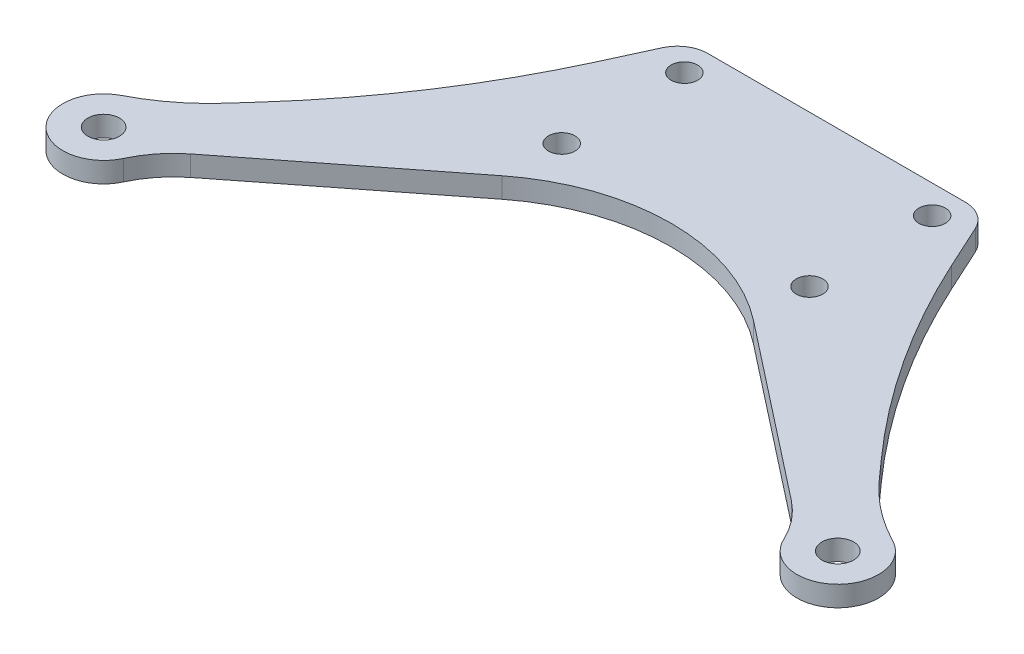
ISO-10303-21;
HEADER;
FILE_DESCRIPTION(('STEP AP214'),'2;1');
FILE_NAME('part.step','',(''),(''),'','','');
FILE_SCHEMA(('AUTOMOTIVE_DESIGN { 1 0 10303 214 1 1 1 1 }'));
ENDSEC;
DATA;
#1=APPLICATION_CONTEXT('core data for automotive mechanical design processes');
#2=APPLICATION_PROTOCOL_DEFINITION('international standard','automotive_design',2000,#1);
#3=PRODUCT_CONTEXT('',#1,'mechanical');
#4=PRODUCT('Part','Part','',(#3));
#5=PRODUCT_RELATED_PRODUCT_CATEGORY('part','',(#4));
#6=PRODUCT_DEFINITION_FORMATION('','',#4);
#7=PRODUCT_DEFINITION_CONTEXT('part definition',#1,'design');
#8=PRODUCT_DEFINITION('design','',#6,#7);
#9=PRODUCT_DEFINITION_SHAPE('','',#8);
#10=(LENGTH_UNIT() NAMED_UNIT(*) SI_UNIT(.MILLI.,.METRE.));
#11=(NAMED_UNIT(*) PLANE_ANGLE_UNIT() SI_UNIT($,.RADIAN.));
#12=(NAMED_UNIT(*) SI_UNIT($,.STERADIAN.) SOLID_ANGLE_UNIT());
#13=UNCERTAINTY_MEASURE_WITH_UNIT(LENGTH_MEASURE(1.E-05),#10,'distance_accuracy_value','');
#14=(GEOMETRIC_REPRESENTATION_CONTEXT(3) GLOBAL_UNCERTAINTY_ASSIGNED_CONTEXT((#13)) GLOBAL_UNIT_ASSIGNED_CONTEXT((#10,
#11,#12)) REPRESENTATION_CONTEXT('',''));
#15=CARTESIAN_POINT('',(0.,0.,0.));
#16=DIRECTION('',(0.,0.,1.));
#17=DIRECTION('',(1.,0.,0.));
#18=AXIS2_PLACEMENT_3D('',#15,#16,#17);
#19=CARTESIAN_POINT('',(-41.9300941590843,2.,-19.2548923078902));
#20=DIRECTION('',(0.90876140001654,0.,0.417316088642623));
#21=DIRECTION('',(0.417316088642623,0.,-0.90876140001654));
#22=AXIS2_PLACEMENT_3D('',#19,#20,#21);
#23=PLANE('',#22);
#24=DIRECTION('',(-0.417316088642623,0.,0.90876140001654));
#25=VECTOR('',#24,1.);
#26=CARTESIAN_POINT('',(-41.9300941590843,0.,-19.2548923078902));
#27=LINE('',#26,#25);
#28=CARTESIAN_POINT('',(-15.3497039199219,0.,-77.1372345039348));
#29=VERTEX_POINT('',#28);
#30=CARTESIAN_POINT('',(-17.3480088101479,0.,-72.7856592852359));
#31=VERTEX_POINT('',#30);
#32=EDGE_CURVE('E230',#29,#31,#27,.T.);
#33=ORIENTED_EDGE('',*,*,#32,.T.);
#34=DIRECTION('',(0.,-1.,0.));
#35=VECTOR('',#34,1.);
#36=CARTESIAN_POINT('',(-17.3480088101479,2.,-72.7856592852359));
#37=LINE('',#36,#35);
#38=CARTESIAN_POINT('',(-17.3480088101479,2.,-72.7856592852359));
#39=VERTEX_POINT('',#38);
#40=EDGE_CURVE('E11',#39,#31,#37,.T.);
#41=ORIENTED_EDGE('',*,*,#40,.F.);
#42=DIRECTION('',(-0.417316088642623,0.,0.90876140001654));
#43=VECTOR('',#42,1.);
#44=CARTESIAN_POINT('',(-41.9300941590843,2.,-19.2548923078902));
#45=LINE('',#44,#43);
#46=CARTESIAN_POINT('',(-15.3497039199219,2.,-77.1372345039348));
#47=VERTEX_POINT('',#46);
#48=EDGE_CURVE('E405',#47,#39,#45,.T.);
#49=ORIENTED_EDGE('',*,*,#48,.F.);
#50=DIRECTION('',(0.,-1.,0.));
#51=VECTOR('',#50,1.);
#52=CARTESIAN_POINT('',(-15.3497039199219,2.,-77.1372345039348));
#53=LINE('',#52,#51);
#54=EDGE_CURVE('E205',#47,#29,#53,.T.);
#55=ORIENTED_EDGE('',*,*,#54,.T.);
#56=EDGE_LOOP('',(#33,#41,#49,#55));
#57=FACE_BOUND('',#56,.T.);
#58=ADVANCED_FACE('F41',(#57),#23,.F.);
#59=CARTESIAN_POINT('',(-90.0489208114712,2.,-106.170946376645));
#60=DIRECTION('',(0.,-1.,0.));
#61=DIRECTION('',(0.,0.,-1.));
#62=AXIS2_PLACEMENT_3D('',#59,#60,#61);
#63=CYLINDRICAL_SURFACE('',#62,80.);
#64=CARTESIAN_POINT('',(-90.0489208114712,0.,-106.170946376645));
#65=DIRECTION('',(0.,1.,0.));
#66=DIRECTION('',(0.,0.,1.));
#67=AXIS2_PLACEMENT_3D('',#64,#65,#66);
#68=CIRCLE('',#67,80.);
#69=CARTESIAN_POINT('',(-30.4024630402206,0.,-52.8577202939704));
#70=VERTEX_POINT('',#69);
#71=EDGE_CURVE('E234',#31,#70,#68,.F.);
#72=ORIENTED_EDGE('',*,*,#71,.T.);
#73=DIRECTION('',(0.,-1.,0.));
#74=VECTOR('',#73,1.);
#75=CARTESIAN_POINT('',(-30.4024630402206,2.,-52.8577202939704));
#76=LINE('',#75,#74);
#77=CARTESIAN_POINT('',(-30.4024630402206,2.,-52.8577202939704));
#78=VERTEX_POINT('',#77);
#79=EDGE_CURVE('E51',#78,#70,#76,.T.);
#80=ORIENTED_EDGE('',*,*,#79,.F.);
#81=CARTESIAN_POINT('',(-90.0489208114712,2.,-106.170946376645));
#82=DIRECTION('',(0.,1.,0.));
#83=DIRECTION('',(0.,0.,1.));
#84=AXIS2_PLACEMENT_3D('',#81,#82,#83);
#85=CIRCLE('',#84,80.);
#86=EDGE_CURVE('E131',#39,#78,#85,.F.);
#87=ORIENTED_EDGE('',*,*,#86,.F.);
#88=ORIENTED_EDGE('',*,*,#40,.T.);
#89=EDGE_LOOP('',(#72,#80,#87,#88));
#90=FACE_BOUND('',#89,.T.);
#91=ADVANCED_FACE('F345',(#90),#63,.F.);
#92=CARTESIAN_POINT('',(-43.163670076453,2.,-38.5805727168108));
#93=DIRECTION('',(-0.745580722140635,0.,-0.666415326033435));
#94=DIRECTION('',(-0.666415326033435,0.,0.745580722140635));
#95=AXIS2_PLACEMENT_3D('',#92,#93,#94);
#96=PLANE('',#95);
#97=DIRECTION('',(0.666415326033435,0.,-0.745580722140635));
#98=VECTOR('',#97,1.);
#99=CARTESIAN_POINT('',(-43.163670076453,0.,-38.5805727168108));
#100=LINE('',#99,#98);
#101=CARTESIAN_POINT('',(-32.0372785443259,0.,-51.0287003472468));
#102=VERTEX_POINT('',#101);
#103=EDGE_CURVE('E238',#102,#70,#100,.T.);
#104=ORIENTED_EDGE('',*,*,#103,.F.);
#105=DIRECTION('',(0.,-1.,0.));
#106=VECTOR('',#105,1.);
#107=CARTESIAN_POINT('',(-32.0372785443259,2.,-51.0287003472468));
#108=LINE('',#107,#106);
#109=CARTESIAN_POINT('',(-32.0372785443259,2.,-51.0287003472468));
#110=VERTEX_POINT('',#109);
#111=EDGE_CURVE('E336',#110,#102,#108,.T.);
#112=ORIENTED_EDGE('',*,*,#111,.F.);
#113=DIRECTION('',(0.666415326033435,0.,-0.745580722140635));
#114=VECTOR('',#113,1.);
#115=CARTESIAN_POINT('',(-43.163670076453,2.,-38.5805727168108));
#116=LINE('',#115,#114);
#117=EDGE_CURVE('E344',#110,#78,#116,.T.);
#118=ORIENTED_EDGE('',*,*,#117,.T.);
#119=ORIENTED_EDGE('',*,*,#79,.T.);
#120=EDGE_LOOP('',(#104,#112,#118,#119));
#121=FACE_BOUND('',#120,.T.);
#122=ADVANCED_FACE('F342',(#121),#96,.T.);
#123=CARTESIAN_POINT('',(-46.9488929871386,2.,-64.3570068679155));
#124=DIRECTION('',(0.,-1.,0.));
#125=DIRECTION('',(0.,0.,-1.));
#126=AXIS2_PLACEMENT_3D('',#123,#124,#125);
#127=CYLINDRICAL_SURFACE('',#126,20.);
#128=CARTESIAN_POINT('',(-46.9488929871386,0.,-64.3570068679155));
#129=DIRECTION('',(0.,1.,0.));
#130=DIRECTION('',(0.,0.,1.));
#131=AXIS2_PLACEMENT_3D('',#128,#129,#130);
#132=CIRCLE('',#131,20.);
#133=CARTESIAN_POINT('',(-37.8248154978564,0.,-46.5595011446526));
#134=VERTEX_POINT('',#133);
#135=EDGE_CURVE('E242',#102,#134,#132,.F.);
#136=ORIENTED_EDGE('',*,*,#135,.T.);
#137=DIRECTION('',(0.,-1.,0.));
#138=VECTOR('',#137,1.);
#139=CARTESIAN_POINT('',(-37.8248154978564,2.,-46.5595011446526));
#140=LINE('',#139,#138);
#141=CARTESIAN_POINT('',(-37.8248154978564,2.,-46.5595011446526));
#142=VERTEX_POINT('',#141);
#143=EDGE_CURVE('E332',#142,#134,#140,.T.);
#144=ORIENTED_EDGE('',*,*,#143,.F.);
#145=CARTESIAN_POINT('',(-46.9488929871386,2.,-64.3570068679155));
#146=DIRECTION('',(0.,1.,0.));
#147=DIRECTION('',(0.,0.,1.));
#148=AXIS2_PLACEMENT_3D('',#145,#146,#147);
#149=CIRCLE('',#148,20.);
#150=EDGE_CURVE('E365',#110,#142,#149,.F.);
#151=ORIENTED_EDGE('',*,*,#150,.F.);
#152=ORIENTED_EDGE('',*,*,#111,.T.);
#153=EDGE_LOOP('',(#136,#144,#151,#152));
#154=FACE_BOUND('',#153,.T.);
#155=ADVANCED_FACE('F354',(#154),#127,.F.);
#156=CARTESIAN_POINT('',(-36.,2.,-43.));
#157=DIRECTION('',(0.,-1.,0.));
#158=DIRECTION('',(0.,0.,-1.));
#159=AXIS2_PLACEMENT_3D('',#156,#157,#158);
#160=CYLINDRICAL_SURFACE('',#159,4.);
#161=CARTESIAN_POINT('',(-36.,0.,-43.));
#162=DIRECTION('',(0.,1.,0.));
#163=DIRECTION('',(0.,0.,1.));
#164=AXIS2_PLACEMENT_3D('',#161,#162,#163);
#165=CIRCLE('',#164,4.);
#166=CARTESIAN_POINT('',(-32.370509150583,0.,-41.3186921239708));
#167=VERTEX_POINT('',#166);
#168=EDGE_CURVE('E245',#134,#167,#165,.T.);
#169=ORIENTED_EDGE('',*,*,#168,.T.);
#170=DIRECTION('',(0.,-1.,0.));
#171=VECTOR('',#170,1.);
#172=CARTESIAN_POINT('',(-32.370509150583,2.,-41.3186921239708));
#173=LINE('',#172,#171);
#174=CARTESIAN_POINT('',(-32.370509150583,2.,-41.3186921239708));
#175=VERTEX_POINT('',#174);
#176=EDGE_CURVE('E329',#175,#167,#173,.T.);
#177=ORIENTED_EDGE('',*,*,#176,.F.);
#178=CARTESIAN_POINT('',(-36.,2.,-43.));
#179=DIRECTION('',(0.,1.,0.));
#180=DIRECTION('',(0.,0.,1.));
#181=AXIS2_PLACEMENT_3D('',#178,#179,#180);
#182=CIRCLE('',#181,4.);
#183=EDGE_CURVE('E360',#142,#175,#182,.T.);
#184=ORIENTED_EDGE('',*,*,#183,.F.);
#185=ORIENTED_EDGE('',*,*,#143,.T.);
#186=EDGE_LOOP('',(#169,#177,#184,#185));
#187=FACE_BOUND('',#186,.T.);
#188=ADVANCED_FACE('F358',(#187),#160,.T.);
#189=CARTESIAN_POINT('',(-23.2967820270404,2.,-37.1154224338977));
#190=DIRECTION('',(0.,-1.,0.));
#191=DIRECTION('',(0.,0.,-1.));
#192=AXIS2_PLACEMENT_3D('',#189,#190,#191);
#193=CYLINDRICAL_SURFACE('',#192,10.);
#194=CARTESIAN_POINT('',(-23.2967820270404,0.,-37.1154224338977));
#195=DIRECTION('',(0.,1.,0.));
#196=DIRECTION('',(0.,0.,1.));
#197=AXIS2_PLACEMENT_3D('',#194,#195,#196);
#198=CIRCLE('',#197,10.);
#199=CARTESIAN_POINT('',(-29.4647501668188,0.,-44.9866465462374));
#200=VERTEX_POINT('',#199);
#201=EDGE_CURVE('E249',#200,#167,#198,.T.);
#202=ORIENTED_EDGE('',*,*,#201,.F.);
#203=DIRECTION('',(0.,-1.,0.));
#204=VECTOR('',#203,1.);
#205=CARTESIAN_POINT('',(-29.4647501668188,2.,-44.9866465462374));
#206=LINE('',#205,#204);
#207=CARTESIAN_POINT('',(-29.4647501668188,2.,-44.9866465462374));
#208=VERTEX_POINT('',#207);
#209=EDGE_CURVE('E326',#208,#200,#206,.T.);
#210=ORIENTED_EDGE('',*,*,#209,.F.);
#211=CARTESIAN_POINT('',(-23.2967820270404,2.,-37.1154224338977));
#212=DIRECTION('',(0.,1.,0.));
#213=DIRECTION('',(0.,0.,1.));
#214=AXIS2_PLACEMENT_3D('',#211,#212,#213);
#215=CIRCLE('',#214,10.);
#216=EDGE_CURVE('E364',#208,#175,#215,.T.);
#217=ORIENTED_EDGE('',*,*,#216,.T.);
#218=ORIENTED_EDGE('',*,*,#176,.T.);
#219=EDGE_LOOP('',(#202,#210,#217,#218));
#220=FACE_BOUND('',#219,.T.);
#221=ADVANCED_FACE('F614',(#220),#193,.F.);
#222=CARTESIAN_POINT('',(-33.0502935162287,2.,-42.1769797361812));
#223=DIRECTION('',(-0.616796813977841,0.,-0.787122411233974));
#224=DIRECTION('',(-0.787122411233974,0.,0.616796813977841));
#225=AXIS2_PLACEMENT_3D('',#222,#223,#224);
#226=PLANE('',#225);
#227=DIRECTION('',(0.787122411233974,0.,-0.616796813977841));
#228=VECTOR('',#227,1.);
#229=CARTESIAN_POINT('',(-33.0502935162287,0.,-42.1769797361812));
#230=LINE('',#229,#228);
#231=CARTESIAN_POINT('',(-12.3359362795569,0.,-58.4089525079236));
#232=VERTEX_POINT('',#231);
#233=EDGE_CURVE('E253',#200,#232,#230,.T.);
#234=ORIENTED_EDGE('',*,*,#233,.T.);
#235=DIRECTION('',(0.,-1.,0.));
#236=VECTOR('',#235,1.);
#237=CARTESIAN_POINT('',(-12.3359362795569,2.,-58.4089525079236));
#238=LINE('',#237,#236);
#239=CARTESIAN_POINT('',(-12.3359362795569,2.,-58.4089525079236));
#240=VERTEX_POINT('',#239);
#241=EDGE_CURVE('E322',#240,#232,#238,.T.);
#242=ORIENTED_EDGE('',*,*,#241,.F.);
#243=DIRECTION('',(0.787122411233974,0.,-0.616796813977841));
#244=VECTOR('',#243,1.);
#245=CARTESIAN_POINT('',(-33.0502935162287,2.,-42.1769797361812));
#246=LINE('',#245,#244);
#247=EDGE_CURVE('E369',#208,#240,#246,.T.);
#248=ORIENTED_EDGE('',*,*,#247,.F.);
#249=ORIENTED_EDGE('',*,*,#209,.T.);
#250=EDGE_LOOP('',(#234,#242,#248,#249));
#251=FACE_BOUND('',#250,.T.);
#252=ADVANCED_FACE('F604',(#251),#226,.F.);
#253=CARTESIAN_POINT('',(0.,2.,-42.6665042832441));
#254=DIRECTION('',(0.,-1.,0.));
#255=DIRECTION('',(0.,0.,-1.));
#256=AXIS2_PLACEMENT_3D('',#253,#254,#255);
#257=CYLINDRICAL_SURFACE('',#256,20.);
#258=CARTESIAN_POINT('',(0.,0.,-42.6665042832441));
#259=DIRECTION('',(0.,1.,0.));
#260=DIRECTION('',(0.,0.,1.));
#261=AXIS2_PLACEMENT_3D('',#258,#259,#260);
#262=CIRCLE('',#261,20.);
#263=CARTESIAN_POINT('',(12.3359362795568,0.,-58.4089525079236));
#264=VERTEX_POINT('',#263);
#265=EDGE_CURVE('E256',#232,#264,#262,.F.);
#266=ORIENTED_EDGE('',*,*,#265,.T.);
#267=DIRECTION('',(0.,-1.,0.));
#268=VECTOR('',#267,1.);
#269=CARTESIAN_POINT('',(12.3359362795568,2.,-58.4089525079236));
#270=LINE('',#269,#268);
#271=CARTESIAN_POINT('',(12.3359362795568,2.,-58.4089525079236));
#272=VERTEX_POINT('',#271);
#273=EDGE_CURVE('E318',#272,#264,#270,.T.);
#274=ORIENTED_EDGE('',*,*,#273,.F.);
#275=CARTESIAN_POINT('',(0.,2.,-42.6665042832441));
#276=DIRECTION('',(0.,1.,0.));
#277=DIRECTION('',(0.,0.,1.));
#278=AXIS2_PLACEMENT_3D('',#275,#276,#277);
#279=CIRCLE('',#278,20.);
#280=EDGE_CURVE('E376',#240,#272,#279,.F.);
#281=ORIENTED_EDGE('',*,*,#280,.F.);
#282=ORIENTED_EDGE('',*,*,#241,.T.);
#283=EDGE_LOOP('',(#266,#274,#281,#282));
#284=FACE_BOUND('',#283,.T.);
#285=ADVANCED_FACE('F594',(#284),#257,.F.);
#286=CARTESIAN_POINT('',(33.0502935162286,2.,-42.1769797361813));
#287=DIRECTION('',(0.616796813977839,0.,-0.787122411233975));
#288=DIRECTION('',(-0.787122411233975,0.,-0.616796813977839));
#289=AXIS2_PLACEMENT_3D('',#286,#287,#288);
#290=PLANE('',#289);
#291=DIRECTION('',(0.787122411233975,0.,0.616796813977839));
#292=VECTOR('',#291,1.);
#293=CARTESIAN_POINT('',(33.0502935162286,0.,-42.1769797361813));
#294=LINE('',#293,#292);
#295=CARTESIAN_POINT('',(29.4647501668187,0.,-44.9866465462374));
#296=VERTEX_POINT('',#295);
#297=EDGE_CURVE('E259',#264,#296,#294,.T.);
#298=ORIENTED_EDGE('',*,*,#297,.T.);
#299=DIRECTION('',(0.,-1.,0.));
#300=VECTOR('',#299,1.);
#301=CARTESIAN_POINT('',(29.4647501668187,2.,-44.9866465462374));
#302=LINE('',#301,#300);
#303=CARTESIAN_POINT('',(29.4647501668187,2.,-44.9866465462374));
#304=VERTEX_POINT('',#303);
#305=EDGE_CURVE('E314',#304,#296,#302,.T.);
#306=ORIENTED_EDGE('',*,*,#305,.F.);
#307=DIRECTION('',(0.787122411233975,0.,0.616796813977839));
#308=VECTOR('',#307,1.);
#309=CARTESIAN_POINT('',(33.0502935162286,2.,-42.1769797361813));
#310=LINE('',#309,#308);
#311=EDGE_CURVE('E379',#272,#304,#310,.T.);
#312=ORIENTED_EDGE('',*,*,#311,.F.);
#313=ORIENTED_EDGE('',*,*,#273,.T.);
#314=EDGE_LOOP('',(#298,#306,#312,#313));
#315=FACE_BOUND('',#314,.T.);
#316=ADVANCED_FACE('F584',(#315),#290,.F.);
#317=CARTESIAN_POINT('',(23.2967820270403,2.,-37.1154224338977));
#318=DIRECTION('',(0.,-1.,0.));
#319=DIRECTION('',(0.,0.,-1.));
#320=AXIS2_PLACEMENT_3D('',#317,#318,#319);
#321=CYLINDRICAL_SURFACE('',#320,10.);
#322=CARTESIAN_POINT('',(23.2967820270403,0.,-37.1154224338977));
#323=DIRECTION('',(0.,1.,0.));
#324=DIRECTION('',(0.,0.,1.));
#325=AXIS2_PLACEMENT_3D('',#322,#323,#324);
#326=CIRCLE('',#325,10.);
#327=CARTESIAN_POINT('',(32.3705091505829,0.,-41.3186921239708));
#328=VERTEX_POINT('',#327);
#329=EDGE_CURVE('E262',#296,#328,#326,.F.);
#330=ORIENTED_EDGE('',*,*,#329,.T.);
#331=DIRECTION('',(0.,-1.,0.));
#332=VECTOR('',#331,1.);
#333=CARTESIAN_POINT('',(32.3705091505829,2.,-41.3186921239708));
#334=LINE('',#333,#332);
#335=CARTESIAN_POINT('',(32.3705091505829,2.,-41.3186921239708));
#336=VERTEX_POINT('',#335);
#337=EDGE_CURVE('E310',#336,#328,#334,.T.);
#338=ORIENTED_EDGE('',*,*,#337,.F.);
#339=CARTESIAN_POINT('',(23.2967820270403,2.,-37.1154224338977));
#340=DIRECTION('',(0.,1.,0.));
#341=DIRECTION('',(0.,0.,1.));
#342=AXIS2_PLACEMENT_3D('',#339,#340,#341);
#343=CIRCLE('',#342,10.);
#344=EDGE_CURVE('E382',#304,#336,#343,.F.);
#345=ORIENTED_EDGE('',*,*,#344,.F.);
#346=ORIENTED_EDGE('',*,*,#305,.T.);
#347=EDGE_LOOP('',(#330,#338,#345,#346));
#348=FACE_BOUND('',#347,.T.);
#349=ADVANCED_FACE('F573',(#348),#321,.F.);
#350=CARTESIAN_POINT('',(36.,2.,-43.));
#351=DIRECTION('',(0.,-1.,0.));
#352=DIRECTION('',(0.,0.,-1.));
#353=AXIS2_PLACEMENT_3D('',#350,#351,#352);
#354=CYLINDRICAL_SURFACE('',#353,3.99999999999999);
#355=CARTESIAN_POINT('',(36.,0.,-43.));
#356=DIRECTION('',(0.,1.,0.));
#357=DIRECTION('',(0.,0.,1.));
#358=AXIS2_PLACEMENT_3D('',#355,#356,#357);
#359=CIRCLE('',#358,3.99999999999999);
#360=CARTESIAN_POINT('',(37.8248154978564,0.,-46.5595011446526));
#361=VERTEX_POINT('',#360);
#362=EDGE_CURVE('E265',#328,#361,#359,.T.);
#363=ORIENTED_EDGE('',*,*,#362,.T.);
#364=DIRECTION('',(0.,-1.,0.));
#365=VECTOR('',#364,1.);
#366=CARTESIAN_POINT('',(37.8248154978564,2.,-46.5595011446526));
#367=LINE('',#366,#365);
#368=CARTESIAN_POINT('',(37.8248154978564,2.,-46.5595011446526));
#369=VERTEX_POINT('',#368);
#370=EDGE_CURVE('E306',#369,#361,#367,.T.);
#371=ORIENTED_EDGE('',*,*,#370,.F.);
#372=CARTESIAN_POINT('',(36.,2.,-43.));
#373=DIRECTION('',(0.,1.,0.));
#374=DIRECTION('',(0.,0.,1.));
#375=AXIS2_PLACEMENT_3D('',#372,#373,#374);
#376=CIRCLE('',#375,3.99999999999999);
#377=EDGE_CURVE('E385',#336,#369,#376,.T.);
#378=ORIENTED_EDGE('',*,*,#377,.F.);
#379=ORIENTED_EDGE('',*,*,#337,.T.);
#380=EDGE_LOOP('',(#363,#371,#378,#379));
#381=FACE_BOUND('',#380,.T.);
#382=ADVANCED_FACE('F563',(#381),#354,.T.);
#383=CARTESIAN_POINT('',(46.9488929871385,2.,-64.3570068679155));
#384=DIRECTION('',(0.,-1.,0.));
#385=DIRECTION('',(0.,0.,-1.));
#386=AXIS2_PLACEMENT_3D('',#383,#384,#385);
#387=CYLINDRICAL_SURFACE('',#386,20.);
#388=CARTESIAN_POINT('',(46.9488929871385,0.,-64.3570068679155));
#389=DIRECTION('',(0.,1.,0.));
#390=DIRECTION('',(0.,0.,1.));
#391=AXIS2_PLACEMENT_3D('',#388,#389,#390);
#392=CIRCLE('',#391,20.);
#393=CARTESIAN_POINT('',(32.0372785443258,0.,-51.0287003472467));
#394=VERTEX_POINT('',#393);
#395=EDGE_CURVE('E268',#361,#394,#392,.F.);
#396=ORIENTED_EDGE('',*,*,#395,.T.);
#397=DIRECTION('',(0.,-1.,0.));
#398=VECTOR('',#397,1.);
#399=CARTESIAN_POINT('',(32.0372785443258,2.,-51.0287003472467));
#400=LINE('',#399,#398);
#401=CARTESIAN_POINT('',(32.0372785443258,2.,-51.0287003472467));
#402=VERTEX_POINT('',#401);
#403=EDGE_CURVE('E302',#402,#394,#400,.T.);
#404=ORIENTED_EDGE('',*,*,#403,.F.);
#405=CARTESIAN_POINT('',(46.9488929871385,2.,-64.3570068679155));
#406=DIRECTION('',(0.,1.,0.));
#407=DIRECTION('',(0.,0.,1.));
#408=AXIS2_PLACEMENT_3D('',#405,#406,#407);
#409=CIRCLE('',#408,20.);
#410=EDGE_CURVE('E388',#369,#402,#409,.F.);
#411=ORIENTED_EDGE('',*,*,#410,.F.);
#412=ORIENTED_EDGE('',*,*,#370,.T.);
#413=EDGE_LOOP('',(#396,#404,#411,#412));
#414=FACE_BOUND('',#413,.T.);
#415=ADVANCED_FACE('F553',(#414),#387,.F.);
#416=CARTESIAN_POINT('',(43.1636700764538,2.,-38.5805727168091));
#417=DIRECTION('',(-0.745580722140656,0.,0.666415326033412));
#418=DIRECTION('',(0.666415326033412,0.,0.745580722140656));
#419=AXIS2_PLACEMENT_3D('',#416,#417,#418);
#420=PLANE('',#419);
#421=DIRECTION('',(-0.666415326033412,0.,-0.745580722140656));
#422=VECTOR('',#421,1.);
#423=CARTESIAN_POINT('',(43.1636700764538,0.,-38.5805727168091));
#424=LINE('',#423,#422);
#425=CARTESIAN_POINT('',(30.4024630402205,0.,-52.8577202939706));
#426=VERTEX_POINT('',#425);
#427=EDGE_CURVE('E271',#394,#426,#424,.T.);
#428=ORIENTED_EDGE('',*,*,#427,.T.);
#429=DIRECTION('',(0.,-1.,0.));
#430=VECTOR('',#429,1.);
#431=CARTESIAN_POINT('',(30.4024630402205,2.,-52.8577202939706));
#432=LINE('',#431,#430);
#433=CARTESIAN_POINT('',(30.4024630402205,2.,-52.8577202939706));
#434=VERTEX_POINT('',#433);
#435=EDGE_CURVE('E299',#434,#426,#432,.T.);
#436=ORIENTED_EDGE('',*,*,#435,.F.);
#437=DIRECTION('',(-0.666415326033412,0.,-0.745580722140656));
#438=VECTOR('',#437,1.);
#439=CARTESIAN_POINT('',(43.1636700764538,2.,-38.5805727168091));
#440=LINE('',#439,#438);
#441=EDGE_CURVE('E391',#402,#434,#440,.T.);
#442=ORIENTED_EDGE('',*,*,#441,.F.);
#443=ORIENTED_EDGE('',*,*,#403,.T.);
#444=EDGE_LOOP('',(#428,#436,#442,#443));
#445=FACE_BOUND('',#444,.T.);
#446=ADVANCED_FACE('F544',(#445),#420,.F.);
#447=CARTESIAN_POINT('',(90.048920811471,2.,-106.170946376646));
#448=DIRECTION('',(0.,-1.,0.));
#449=DIRECTION('',(0.,0.,-1.));
#450=AXIS2_PLACEMENT_3D('',#447,#448,#449);
#451=CYLINDRICAL_SURFACE('',#450,79.9999999999999);
#452=CARTESIAN_POINT('',(90.048920811471,0.,-106.170946376646));
#453=DIRECTION('',(0.,1.,0.));
#454=DIRECTION('',(0.,0.,1.));
#455=AXIS2_PLACEMENT_3D('',#452,#453,#454);
#456=CIRCLE('',#455,79.9999999999999);
#457=CARTESIAN_POINT('',(17.348008810148,0.,-72.7856592852356));
#458=VERTEX_POINT('',#457);
#459=EDGE_CURVE('E275',#458,#426,#456,.T.);
#460=ORIENTED_EDGE('',*,*,#459,.F.);
#461=DIRECTION('',(0.,-1.,0.));
#462=VECTOR('',#461,1.);
#463=CARTESIAN_POINT('',(17.348008810148,2.,-72.7856592852356));
#464=LINE('',#463,#462);
#465=CARTESIAN_POINT('',(17.348008810148,2.,-72.7856592852356));
#466=VERTEX_POINT('',#465);
#467=EDGE_CURVE('E296',#466,#458,#464,.T.);
#468=ORIENTED_EDGE('',*,*,#467,.F.);
#469=CARTESIAN_POINT('',(90.048920811471,2.,-106.170946376646));
#470=DIRECTION('',(0.,1.,0.));
#471=DIRECTION('',(0.,0.,1.));
#472=AXIS2_PLACEMENT_3D('',#469,#470,#471);
#473=CIRCLE('',#472,79.9999999999999);
#474=EDGE_CURVE('E199',#466,#434,#473,.T.);
#475=ORIENTED_EDGE('',*,*,#474,.T.);
#476=ORIENTED_EDGE('',*,*,#435,.T.);
#477=EDGE_LOOP('',(#460,#468,#475,#476));
#478=FACE_BOUND('',#477,.T.);
#479=ADVANCED_FACE('F397',(#478),#451,.F.);
#480=CARTESIAN_POINT('',(41.9300941590843,2.,-19.2548923078902));
#481=DIRECTION('',(0.90876140001654,0.,-0.417316088642624));
#482=DIRECTION('',(-0.417316088642624,0.,-0.90876140001654));
#483=AXIS2_PLACEMENT_3D('',#480,#481,#482);
#484=PLANE('',#483);
#485=DIRECTION('',(0.417316088642624,0.,0.90876140001654));
#486=VECTOR('',#485,1.);
#487=CARTESIAN_POINT('',(41.9300941590843,0.,-19.2548923078902));
#488=LINE('',#487,#486);
#489=CARTESIAN_POINT('',(15.3497039199219,0.,-77.1372345039348));
#490=VERTEX_POINT('',#489);
#491=EDGE_CURVE('E279',#490,#458,#488,.T.);
#492=ORIENTED_EDGE('',*,*,#491,.F.);
#493=DIRECTION('',(0.,-1.,0.));
#494=VECTOR('',#493,1.);
#495=CARTESIAN_POINT('',(15.3497039199219,2.,-77.1372345039348));
#496=LINE('',#495,#494);
#497=CARTESIAN_POINT('',(15.3497039199219,2.,-77.1372345039348));
#498=VERTEX_POINT('',#497);
#499=EDGE_CURVE('E184',#498,#490,#496,.T.);
#500=ORIENTED_EDGE('',*,*,#499,.F.);
#501=DIRECTION('',(0.417316088642624,0.,0.90876140001654));
#502=VECTOR('',#501,1.);
#503=CARTESIAN_POINT('',(41.9300941590843,2.,-19.2548923078902));
#504=LINE('',#503,#502);
#505=EDGE_CURVE('E195',#498,#466,#504,.T.);
#506=ORIENTED_EDGE('',*,*,#505,.T.);
#507=ORIENTED_EDGE('',*,*,#467,.T.);
#508=EDGE_LOOP('',(#492,#500,#506,#507));
#509=FACE_BOUND('',#508,.T.);
#510=ADVANCED_FACE('F402',(#509),#484,.T.);
#511=CARTESIAN_POINT('',(12.6234197198723,2.,-75.8852862380069));
#512=DIRECTION('',(0.,-1.,0.));
#513=DIRECTION('',(0.,0.,-1.));
#514=AXIS2_PLACEMENT_3D('',#511,#512,#513);
#515=CYLINDRICAL_SURFACE('',#514,3.00000000000001);
#516=CARTESIAN_POINT('',(12.6234197198723,0.,-75.8852862380069));
#517=DIRECTION('',(0.,1.,0.));
#518=DIRECTION('',(0.,0.,1.));
#519=AXIS2_PLACEMENT_3D('',#516,#517,#518);
#520=CIRCLE('',#519,3.00000000000001);
#521=CARTESIAN_POINT('',(12.6234197198723,0.,-78.8852862380069));
#522=VERTEX_POINT('',#521);
#523=EDGE_CURVE('E182',#522,#490,#520,.F.);
#524=ORIENTED_EDGE('',*,*,#523,.F.);
#525=DIRECTION('',(0.,-1.,0.));
#526=VECTOR('',#525,1.);
#527=CARTESIAN_POINT('',(12.6234197198723,2.,-78.8852862380069));
#528=LINE('',#527,#526);
#529=CARTESIAN_POINT('',(12.6234197198723,2.,-78.8852862380069));
#530=VERTEX_POINT('',#529);
#531=EDGE_CURVE('E176',#530,#522,#528,.T.);
#532=ORIENTED_EDGE('',*,*,#531,.F.);
#533=CARTESIAN_POINT('',(12.6234197198723,2.,-75.8852862380069));
#534=DIRECTION('',(0.,1.,0.));
#535=DIRECTION('',(0.,0.,1.));
#536=AXIS2_PLACEMENT_3D('',#533,#534,#535);
#537=CIRCLE('',#536,3.00000000000001);
#538=EDGE_CURVE('E180',#530,#498,#537,.F.);
#539=ORIENTED_EDGE('',*,*,#538,.T.);
#540=ORIENTED_EDGE('',*,*,#499,.T.);
#541=EDGE_LOOP('',(#524,#532,#539,#540));
#542=FACE_BOUND('',#541,.T.);
#543=ADVANCED_FACE('F178',(#542),#515,.T.);
#544=CARTESIAN_POINT('',(0.,2.,-78.8852862380069));
#545=DIRECTION('',(0.,0.,1.));
#546=DIRECTION('',(1.,0.,0.));
#547=AXIS2_PLACEMENT_3D('',#544,#545,#546);
#548=PLANE('',#547);
#549=DIRECTION('',(-1.,0.,0.));
#550=VECTOR('',#549,1.);
#551=CARTESIAN_POINT('',(0.,0.,-78.8852862380069));
#552=LINE('',#551,#550);
#553=CARTESIAN_POINT('',(-12.6234197198723,0.,-78.8852862380069));
#554=VERTEX_POINT('',#553);
#555=EDGE_CURVE('E117',#522,#554,#552,.T.);
#556=ORIENTED_EDGE('',*,*,#555,.T.);
#557=DIRECTION('',(0.,-1.,0.));
#558=VECTOR('',#557,1.);
#559=CARTESIAN_POINT('',(-12.6234197198723,2.,-78.8852862380069));
#560=LINE('',#559,#558);
#561=CARTESIAN_POINT('',(-12.6234197198723,2.,-78.8852862380069));
#562=VERTEX_POINT('',#561);
#563=EDGE_CURVE('E185',#562,#554,#560,.T.);
#564=ORIENTED_EDGE('',*,*,#563,.F.);
#565=DIRECTION('',(-1.,0.,0.));
#566=VECTOR('',#565,1.);
#567=CARTESIAN_POINT('',(0.,2.,-78.8852862380069));
#568=LINE('',#567,#566);
#569=EDGE_CURVE('E187',#530,#562,#568,.T.);
#570=ORIENTED_EDGE('',*,*,#569,.F.);
#571=ORIENTED_EDGE('',*,*,#531,.T.);
#572=EDGE_LOOP('',(#556,#564,#570,#571));
#573=FACE_BOUND('',#572,.T.);
#574=ADVANCED_FACE('F188',(#573),#548,.F.);
#575=CARTESIAN_POINT('',(12.15,2.,-64.0755127354948));
#576=DIRECTION('',(0.,-1.,0.));
#577=DIRECTION('',(0.,0.,-1.));
#578=AXIS2_PLACEMENT_3D('',#575,#576,#577);
#579=CYLINDRICAL_SURFACE('',#578,1.3);
#580=CARTESIAN_POINT('',(12.15,2.,-64.0755127354948));
#581=DIRECTION('',(0.,1.,0.));
#582=DIRECTION('',(0.,0.,1.));
#583=AXIS2_PLACEMENT_3D('',#580,#581,#582);
#584=CIRCLE('',#583,1.3);
#585=CARTESIAN_POINT('',(12.15,2.,-62.7755127354948));
#586=VERTEX_POINT('',#585);
#587=EDGE_CURVE('E707',#586,#586,#584,.T.);
#588=ORIENTED_EDGE('',*,*,#587,.T.);
#589=EDGE_LOOP('',(#588));
#590=FACE_BOUND('',#589,.T.);
#591=CARTESIAN_POINT('',(12.15,0.,-64.0755127354948));
#592=DIRECTION('',(0.,1.,0.));
#593=DIRECTION('',(0.,0.,1.));
#594=AXIS2_PLACEMENT_3D('',#591,#592,#593);
#595=CIRCLE('',#594,1.3);
#596=CARTESIAN_POINT('',(12.15,0.,-62.7755127354948));
#597=VERTEX_POINT('',#596);
#598=EDGE_CURVE('E226',#597,#597,#595,.T.);
#599=ORIENTED_EDGE('',*,*,#598,.F.);
#600=EDGE_LOOP('',(#599));
#601=FACE_BOUND('',#600,.T.);
#602=ADVANCED_FACE('F427',(#590,#601),#579,.F.);
#603=CARTESIAN_POINT('',(-12.15,2.,-64.0755127354948));
#604=DIRECTION('',(0.,-1.,0.));
#605=DIRECTION('',(0.,0.,-1.));
#606=AXIS2_PLACEMENT_3D('',#603,#604,#605);
#607=CYLINDRICAL_SURFACE('',#606,1.3);
#608=CARTESIAN_POINT('',(-12.15,2.,-64.0755127354948));
#609=DIRECTION('',(0.,1.,0.));
#610=DIRECTION('',(0.,0.,1.));
#611=AXIS2_PLACEMENT_3D('',#608,#609,#610);
#612=CIRCLE('',#611,1.3);
#613=CARTESIAN_POINT('',(-12.15,2.,-62.7755127354948));
#614=VERTEX_POINT('',#613);
#615=EDGE_CURVE('E703',#614,#614,#612,.T.);
#616=ORIENTED_EDGE('',*,*,#615,.T.);
#617=EDGE_LOOP('',(#616));
#618=FACE_BOUND('',#617,.T.);
#619=CARTESIAN_POINT('',(-12.15,0.,-64.0755127354948));
#620=DIRECTION('',(0.,1.,0.));
#621=DIRECTION('',(0.,0.,1.));
#622=AXIS2_PLACEMENT_3D('',#619,#620,#621);
#623=CIRCLE('',#622,1.3);
#624=CARTESIAN_POINT('',(-12.15,0.,-62.7755127354948));
#625=VERTEX_POINT('',#624);
#626=EDGE_CURVE('E222',#625,#625,#623,.T.);
#627=ORIENTED_EDGE('',*,*,#626,.F.);
#628=EDGE_LOOP('',(#627));
#629=FACE_BOUND('',#628,.T.);
#630=ADVANCED_FACE('F430',(#618,#629),#607,.F.);
#631=CARTESIAN_POINT('',(12.15,2.,-76.1055127354948));
#632=DIRECTION('',(0.,-1.,0.));
#633=DIRECTION('',(0.,0.,-1.));
#634=AXIS2_PLACEMENT_3D('',#631,#632,#633);
#635=CYLINDRICAL_SURFACE('',#634,1.3);
#636=CARTESIAN_POINT('',(12.15,2.,-76.1055127354948));
#637=DIRECTION('',(0.,1.,0.));
#638=DIRECTION('',(0.,0.,1.));
#639=AXIS2_PLACEMENT_3D('',#636,#637,#638);
#640=CIRCLE('',#639,1.3);
#641=CARTESIAN_POINT('',(12.15,2.,-74.8055127354948));
#642=VERTEX_POINT('',#641);
#643=EDGE_CURVE('E695',#642,#642,#640,.T.);
#644=ORIENTED_EDGE('',*,*,#643,.T.);
#645=EDGE_LOOP('',(#644));
#646=FACE_BOUND('',#645,.T.);
#647=CARTESIAN_POINT('',(12.15,0.,-76.1055127354948));
#648=DIRECTION('',(0.,1.,0.));
#649=DIRECTION('',(0.,0.,1.));
#650=AXIS2_PLACEMENT_3D('',#647,#648,#649);
#651=CIRCLE('',#650,1.3);
#652=CARTESIAN_POINT('',(12.15,0.,-74.8055127354948));
#653=VERTEX_POINT('',#652);
#654=EDGE_CURVE('E218',#653,#653,#651,.T.);
#655=ORIENTED_EDGE('',*,*,#654,.F.);
#656=EDGE_LOOP('',(#655));
#657=FACE_BOUND('',#656,.T.);
#658=ADVANCED_FACE('F434',(#646,#657),#635,.F.);
#659=CARTESIAN_POINT('',(-12.15,2.,-76.1055127354948));
#660=DIRECTION('',(0.,-1.,0.));
#661=DIRECTION('',(0.,0.,-1.));
#662=AXIS2_PLACEMENT_3D('',#659,#660,#661);
#663=CYLINDRICAL_SURFACE('',#662,1.3);
#664=CARTESIAN_POINT('',(-12.15,2.,-76.1055127354948));
#665=DIRECTION('',(0.,1.,0.));
#666=DIRECTION('',(0.,0.,1.));
#667=AXIS2_PLACEMENT_3D('',#664,#665,#666);
#668=CIRCLE('',#667,1.3);
#669=CARTESIAN_POINT('',(-12.15,2.,-74.8055127354948));
#670=VERTEX_POINT('',#669);
#671=EDGE_CURVE('E690',#670,#670,#668,.T.);
#672=ORIENTED_EDGE('',*,*,#671,.T.);
#673=EDGE_LOOP('',(#672));
#674=FACE_BOUND('',#673,.T.);
#675=CARTESIAN_POINT('',(-12.15,0.,-76.1055127354948));
#676=DIRECTION('',(0.,1.,0.));
#677=DIRECTION('',(0.,0.,1.));
#678=AXIS2_PLACEMENT_3D('',#675,#676,#677);
#679=CIRCLE('',#678,1.3);
#680=CARTESIAN_POINT('',(-12.15,0.,-74.8055127354948));
#681=VERTEX_POINT('',#680);
#682=EDGE_CURVE('E214',#681,#681,#679,.T.);
#683=ORIENTED_EDGE('',*,*,#682,.F.);
#684=EDGE_LOOP('',(#683));
#685=FACE_BOUND('',#684,.T.);
#686=ADVANCED_FACE('F438',(#674,#685),#663,.F.);
#687=CARTESIAN_POINT('',(-36.,2.,-43.));
#688=DIRECTION('',(0.,-1.,0.));
#689=DIRECTION('',(0.,0.,-1.));
#690=AXIS2_PLACEMENT_3D('',#687,#688,#689);
#691=CYLINDRICAL_SURFACE('',#690,1.55);
#692=CARTESIAN_POINT('',(-36.,2.,-43.));
#693=DIRECTION('',(0.,1.,0.));
#694=DIRECTION('',(0.,0.,1.));
#695=AXIS2_PLACEMENT_3D('',#692,#693,#694);
#696=CIRCLE('',#695,1.55);
#697=CARTESIAN_POINT('',(-36.,2.,-41.45));
#698=VERTEX_POINT('',#697);
#699=EDGE_CURVE('E449',#698,#698,#696,.T.);
#700=ORIENTED_EDGE('',*,*,#699,.T.);
#701=EDGE_LOOP('',(#700));
#702=FACE_BOUND('',#701,.T.);
#703=CARTESIAN_POINT('',(-36.,0.,-43.));
#704=DIRECTION('',(0.,1.,0.));
#705=DIRECTION('',(0.,0.,1.));
#706=AXIS2_PLACEMENT_3D('',#703,#704,#705);
#707=CIRCLE('',#706,1.55);
#708=CARTESIAN_POINT('',(-36.,0.,-41.45));
#709=VERTEX_POINT('',#708);
#710=EDGE_CURVE('E210',#709,#709,#707,.T.);
#711=ORIENTED_EDGE('',*,*,#710,.F.);
#712=EDGE_LOOP('',(#711));
#713=FACE_BOUND('',#712,.T.);
#714=ADVANCED_FACE('F415',(#702,#713),#691,.F.);
#715=CARTESIAN_POINT('',(36.,2.,-43.));
#716=DIRECTION('',(0.,-1.,0.));
#717=DIRECTION('',(0.,0.,-1.));
#718=AXIS2_PLACEMENT_3D('',#715,#716,#717);
#719=CYLINDRICAL_SURFACE('',#718,1.55);
#720=CARTESIAN_POINT('',(36.,2.,-43.));
#721=DIRECTION('',(0.,1.,0.));
#722=DIRECTION('',(0.,0.,1.));
#723=AXIS2_PLACEMENT_3D('',#720,#721,#722);
#724=CIRCLE('',#723,1.55);
#725=CARTESIAN_POINT('',(36.,2.,-41.45));
#726=VERTEX_POINT('',#725);
#727=EDGE_CURVE('E289',#726,#726,#724,.T.);
#728=ORIENTED_EDGE('',*,*,#727,.T.);
#729=EDGE_LOOP('',(#728));
#730=FACE_BOUND('',#729,.T.);
#731=CARTESIAN_POINT('',(36.,0.,-43.));
#732=DIRECTION('',(0.,1.,0.));
#733=DIRECTION('',(0.,0.,1.));
#734=AXIS2_PLACEMENT_3D('',#731,#732,#733);
#735=CIRCLE('',#734,1.55);
#736=CARTESIAN_POINT('',(36.,0.,-41.45));
#737=VERTEX_POINT('',#736);
#738=EDGE_CURVE('E206',#737,#737,#735,.T.);
#739=ORIENTED_EDGE('',*,*,#738,.F.);
#740=EDGE_LOOP('',(#739));
#741=FACE_BOUND('',#740,.T.);
#742=ADVANCED_FACE('F43',(#730,#741),#719,.F.);
#743=CARTESIAN_POINT('',(-12.6234197198723,2.,-75.8852862380069));
#744=DIRECTION('',(0.,-1.,0.));
#745=DIRECTION('',(0.,0.,-1.));
#746=AXIS2_PLACEMENT_3D('',#743,#744,#745);
#747=CYLINDRICAL_SURFACE('',#746,3.);
#748=CARTESIAN_POINT('',(-12.6234197198723,0.,-75.8852862380069));
#749=DIRECTION('',(0.,1.,0.));
#750=DIRECTION('',(0.,0.,1.));
#751=AXIS2_PLACEMENT_3D('',#748,#749,#750);
#752=CIRCLE('',#751,3.);
#753=EDGE_CURVE('E123',#554,#29,#752,.T.);
#754=ORIENTED_EDGE('',*,*,#753,.T.);
#755=ORIENTED_EDGE('',*,*,#54,.F.);
#756=CARTESIAN_POINT('',(-12.6234197198723,2.,-75.8852862380069));
#757=DIRECTION('',(0.,1.,0.));
#758=DIRECTION('',(0.,0.,1.));
#759=AXIS2_PLACEMENT_3D('',#756,#757,#758);
#760=CIRCLE('',#759,3.);
#761=EDGE_CURVE('E59',#562,#47,#760,.T.);
#762=ORIENTED_EDGE('',*,*,#761,.F.);
#763=ORIENTED_EDGE('',*,*,#563,.T.);
#764=EDGE_LOOP('',(#754,#755,#762,#763));
#765=FACE_BOUND('',#764,.T.);
#766=ADVANCED_FACE('F406',(#765),#747,.T.);
#767=CARTESIAN_POINT('',(0.,2.,0.));
#768=DIRECTION('',(0.,1.,0.));
#769=DIRECTION('',(0.,0.,1.));
#770=AXIS2_PLACEMENT_3D('',#767,#768,#769);
#771=PLANE('',#770);
#772=ORIENTED_EDGE('',*,*,#727,.F.);
#773=EDGE_LOOP('',(#772));
#774=FACE_BOUND('',#773,.T.);
#775=ORIENTED_EDGE('',*,*,#699,.F.);
#776=EDGE_LOOP('',(#775));
#777=FACE_BOUND('',#776,.T.);
#778=ORIENTED_EDGE('',*,*,#671,.F.);
#779=EDGE_LOOP('',(#778));
#780=FACE_BOUND('',#779,.T.);
#781=ORIENTED_EDGE('',*,*,#643,.F.);
#782=EDGE_LOOP('',(#781));
#783=FACE_BOUND('',#782,.T.);
#784=ORIENTED_EDGE('',*,*,#615,.F.);
#785=EDGE_LOOP('',(#784));
#786=FACE_BOUND('',#785,.T.);
#787=ORIENTED_EDGE('',*,*,#587,.F.);
#788=EDGE_LOOP('',(#787));
#789=FACE_BOUND('',#788,.T.);
#790=ORIENTED_EDGE('',*,*,#48,.T.);
#791=ORIENTED_EDGE('',*,*,#86,.T.);
#792=ORIENTED_EDGE('',*,*,#117,.F.);
#793=ORIENTED_EDGE('',*,*,#150,.T.);
#794=ORIENTED_EDGE('',*,*,#183,.T.);
#795=ORIENTED_EDGE('',*,*,#216,.F.);
#796=ORIENTED_EDGE('',*,*,#247,.T.);
#797=ORIENTED_EDGE('',*,*,#280,.T.);
#798=ORIENTED_EDGE('',*,*,#311,.T.);
#799=ORIENTED_EDGE('',*,*,#344,.T.);
#800=ORIENTED_EDGE('',*,*,#377,.T.);
#801=ORIENTED_EDGE('',*,*,#410,.T.);
#802=ORIENTED_EDGE('',*,*,#441,.T.);
#803=ORIENTED_EDGE('',*,*,#474,.F.);
#804=ORIENTED_EDGE('',*,*,#505,.F.);
#805=ORIENTED_EDGE('',*,*,#538,.F.);
#806=ORIENTED_EDGE('',*,*,#569,.T.);
#807=ORIENTED_EDGE('',*,*,#761,.T.);
#808=EDGE_LOOP('',(#790,#791,#792,#793,#794,#795,#796,#797,#798,#799,#800,#801,#802,#803,#804,
#805,#806,#807));
#809=FACE_BOUND('',#808,.T.);
#810=ADVANCED_FACE('F192',(#774,#777,#780,#783,#786,#789,#809),#771,.T.);
#811=CARTESIAN_POINT('',(0.,0.,0.));
#812=DIRECTION('',(0.,1.,0.));
#813=DIRECTION('',(0.,0.,1.));
#814=AXIS2_PLACEMENT_3D('',#811,#812,#813);
#815=PLANE('',#814);
#816=ORIENTED_EDGE('',*,*,#738,.T.);
#817=EDGE_LOOP('',(#816));
#818=FACE_BOUND('',#817,.T.);
#819=ORIENTED_EDGE('',*,*,#710,.T.);
#820=EDGE_LOOP('',(#819));
#821=FACE_BOUND('',#820,.T.);
#822=ORIENTED_EDGE('',*,*,#682,.T.);
#823=EDGE_LOOP('',(#822));
#824=FACE_BOUND('',#823,.T.);
#825=ORIENTED_EDGE('',*,*,#654,.T.);
#826=EDGE_LOOP('',(#825));
#827=FACE_BOUND('',#826,.T.);
#828=ORIENTED_EDGE('',*,*,#626,.T.);
#829=EDGE_LOOP('',(#828));
#830=FACE_BOUND('',#829,.T.);
#831=ORIENTED_EDGE('',*,*,#598,.T.);
#832=EDGE_LOOP('',(#831));
#833=FACE_BOUND('',#832,.T.);
#834=ORIENTED_EDGE('',*,*,#32,.F.);
#835=ORIENTED_EDGE('',*,*,#753,.F.);
#836=ORIENTED_EDGE('',*,*,#555,.F.);
#837=ORIENTED_EDGE('',*,*,#523,.T.);
#838=ORIENTED_EDGE('',*,*,#491,.T.);
#839=ORIENTED_EDGE('',*,*,#459,.T.);
#840=ORIENTED_EDGE('',*,*,#427,.F.);
#841=ORIENTED_EDGE('',*,*,#395,.F.);
#842=ORIENTED_EDGE('',*,*,#362,.F.);
#843=ORIENTED_EDGE('',*,*,#329,.F.);
#844=ORIENTED_EDGE('',*,*,#297,.F.);
#845=ORIENTED_EDGE('',*,*,#265,.F.);
#846=ORIENTED_EDGE('',*,*,#233,.F.);
#847=ORIENTED_EDGE('',*,*,#201,.T.);
#848=ORIENTED_EDGE('',*,*,#168,.F.);
#849=ORIENTED_EDGE('',*,*,#135,.F.);
#850=ORIENTED_EDGE('',*,*,#103,.T.);
#851=ORIENTED_EDGE('',*,*,#71,.F.);
#852=EDGE_LOOP('',(#834,#835,#836,#837,#838,#839,#840,#841,#842,#843,#844,#845,#846,#847,#848,
#849,#850,#851));
#853=FACE_BOUND('',#852,.T.);
#854=ADVANCED_FACE('F350',(#818,#821,#824,#827,#830,#833,#853),#815,.F.);
#855=CLOSED_SHELL('',(#58,#91,#122,#155,#188,#221,#252,#285,#316,#349,#382,#415,#446,#479,#510,
#543,#574,#602,#630,#658,#686,#714,#742,#766,#810,#854));
#856=MANIFOLD_SOLID_BREP('B2',#855);
#857=ADVANCED_BREP_SHAPE_REPRESENTATION('',(#18,#856),#14);
#858=SHAPE_DEFINITION_REPRESENTATION(#9,#857);
ENDSEC;
END-ISO-10303-21;
